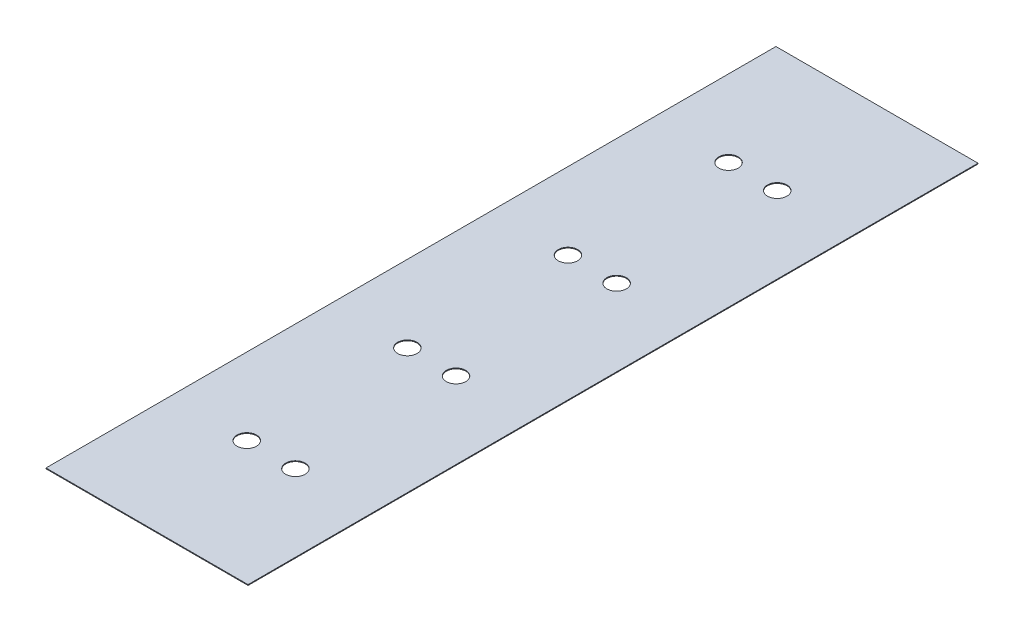
ISO-10303-21;
HEADER;
FILE_DESCRIPTION(('STEP AP214'),'2;1');
FILE_NAME('part.step','',(''),(''),'','','');
FILE_SCHEMA(('AUTOMOTIVE_DESIGN { 1 0 10303 214 1 1 1 1 }'));
ENDSEC;
DATA;
#1=APPLICATION_CONTEXT('core data for automotive mechanical design processes');
#2=APPLICATION_PROTOCOL_DEFINITION('international standard','automotive_design',2000,#1);
#3=PRODUCT_CONTEXT('',#1,'mechanical');
#4=PRODUCT('Part','Part','',(#3));
#5=PRODUCT_RELATED_PRODUCT_CATEGORY('part','',(#4));
#6=PRODUCT_DEFINITION_FORMATION('','',#4);
#7=PRODUCT_DEFINITION_CONTEXT('part definition',#1,'design');
#8=PRODUCT_DEFINITION('design','',#6,#7);
#9=PRODUCT_DEFINITION_SHAPE('','',#8);
#10=(LENGTH_UNIT() NAMED_UNIT(*) SI_UNIT(.MILLI.,.METRE.));
#11=(NAMED_UNIT(*) PLANE_ANGLE_UNIT() SI_UNIT($,.RADIAN.));
#12=(NAMED_UNIT(*) SI_UNIT($,.STERADIAN.) SOLID_ANGLE_UNIT());
#13=UNCERTAINTY_MEASURE_WITH_UNIT(LENGTH_MEASURE(1.E-05),#10,'distance_accuracy_value','');
#14=(GEOMETRIC_REPRESENTATION_CONTEXT(3) GLOBAL_UNCERTAINTY_ASSIGNED_CONTEXT((#13)) GLOBAL_UNIT_ASSIGNED_CONTEXT((#10,
#11,#12)) REPRESENTATION_CONTEXT('',''));
#15=CARTESIAN_POINT('',(0.,0.,0.));
#16=DIRECTION('',(0.,0.,1.));
#17=DIRECTION('',(1.,0.,0.));
#18=AXIS2_PLACEMENT_3D('',#15,#16,#17);
#19=CARTESIAN_POINT('',(0.8,10.,750.));
#20=DIRECTION('',(0.,0.,1.));
#21=DIRECTION('',(1.,0.,0.));
#22=AXIS2_PLACEMENT_3D('',#19,#20,#21);
#23=PLANE('',#22);
#24=DIRECTION('',(1.,0.,0.));
#25=VECTOR('',#24,1.);
#26=CARTESIAN_POINT('',(4.,14.,750.));
#27=LINE('',#26,#25);
#28=CARTESIAN_POINT('',(-21.3097335529232,14.0000000000001,750.));
#29=VERTEX_POINT('',#28);
#30=CARTESIAN_POINT('',(186.309733552923,14.0000000000001,750.));
#31=VERTEX_POINT('',#30);
#32=EDGE_CURVE('E57',#29,#31,#27,.T.);
#33=ORIENTED_EDGE('',*,*,#32,.F.);
#34=DIRECTION('',(0.,1.,0.));
#35=VECTOR('',#34,1.);
#36=CARTESIAN_POINT('',(-21.3097335529233,13.2000000000001,750.));
#37=LINE('',#36,#35);
#38=CARTESIAN_POINT('',(-21.3097335529233,13.2000000000001,750.));
#39=VERTEX_POINT('',#38);
#40=EDGE_CURVE('E116',#39,#29,#37,.T.);
#41=ORIENTED_EDGE('',*,*,#40,.F.);
#42=DIRECTION('',(1.,0.,0.));
#43=VECTOR('',#42,1.);
#44=CARTESIAN_POINT('',(4.,13.2,750.));
#45=LINE('',#44,#43);
#46=CARTESIAN_POINT('',(186.309733552923,13.2000000000001,750.));
#47=VERTEX_POINT('',#46);
#48=EDGE_CURVE('E12',#39,#47,#45,.T.);
#49=ORIENTED_EDGE('',*,*,#48,.T.);
#50=DIRECTION('',(0.,-1.,0.));
#51=VECTOR('',#50,1.);
#52=CARTESIAN_POINT('',(186.309733552923,14.0000000000001,750.));
#53=LINE('',#52,#51);
#54=EDGE_CURVE('E101',#31,#47,#53,.T.);
#55=ORIENTED_EDGE('',*,*,#54,.F.);
#56=EDGE_LOOP('',(#33,#41,#49,#55));
#57=FACE_BOUND('',#56,.T.);
#58=ADVANCED_FACE('F47',(#57),#23,.T.);
#59=CARTESIAN_POINT('',(164.2,10.,0.));
#60=DIRECTION('',(0.,0.,-1.));
#61=DIRECTION('',(-1.,0.,0.));
#62=AXIS2_PLACEMENT_3D('',#59,#60,#61);
#63=PLANE('',#62);
#64=DIRECTION('',(1.,0.,0.));
#65=VECTOR('',#64,1.);
#66=CARTESIAN_POINT('',(4.,14.,0.));
#67=LINE('',#66,#65);
#68=CARTESIAN_POINT('',(-21.3097335529232,14.0000000000001,0.));
#69=VERTEX_POINT('',#68);
#70=CARTESIAN_POINT('',(186.309733552923,14.0000000000001,0.));
#71=VERTEX_POINT('',#70);
#72=EDGE_CURVE('E77',#69,#71,#67,.T.);
#73=ORIENTED_EDGE('',*,*,#72,.T.);
#74=DIRECTION('',(0.,-1.,0.));
#75=VECTOR('',#74,1.);
#76=CARTESIAN_POINT('',(186.309733552923,14.0000000000001,0.));
#77=LINE('',#76,#75);
#78=CARTESIAN_POINT('',(186.309733552923,13.2000000000001,0.));
#79=VERTEX_POINT('',#78);
#80=EDGE_CURVE('E103',#71,#79,#77,.T.);
#81=ORIENTED_EDGE('',*,*,#80,.T.);
#82=DIRECTION('',(1.,0.,0.));
#83=VECTOR('',#82,1.);
#84=CARTESIAN_POINT('',(4.,13.2,0.));
#85=LINE('',#84,#83);
#86=CARTESIAN_POINT('',(-21.3097335529233,13.2000000000001,0.));
#87=VERTEX_POINT('',#86);
#88=EDGE_CURVE('E90',#87,#79,#85,.T.);
#89=ORIENTED_EDGE('',*,*,#88,.F.);
#90=DIRECTION('',(0.,1.,0.));
#91=VECTOR('',#90,1.);
#92=CARTESIAN_POINT('',(-21.3097335529233,13.2000000000001,0.));
#93=LINE('',#92,#91);
#94=EDGE_CURVE('E109',#87,#69,#93,.T.);
#95=ORIENTED_EDGE('',*,*,#94,.T.);
#96=EDGE_LOOP('',(#73,#81,#89,#95));
#97=FACE_BOUND('',#96,.T.);
#98=ADVANCED_FACE('F185',(#97),#63,.T.);
#99=CARTESIAN_POINT('',(4.,14.,750.));
#100=DIRECTION('',(0.,1.,0.));
#101=DIRECTION('',(-1.,0.,0.));
#102=AXIS2_PLACEMENT_3D('',#99,#100,#101);
#103=PLANE('',#102);
#104=CARTESIAN_POINT('',(107.5,14.,292.5));
#105=DIRECTION('',(0.,1.,0.));
#106=DIRECTION('',(0.,0.,1.));
#107=AXIS2_PLACEMENT_3D('',#104,#105,#106);
#108=CIRCLE('',#107,10.);
#109=CARTESIAN_POINT('',(107.5,14.,302.5));
#110=VERTEX_POINT('',#109);
#111=EDGE_CURVE('E118',#110,#110,#108,.T.);
#112=ORIENTED_EDGE('',*,*,#111,.F.);
#113=EDGE_LOOP('',(#112));
#114=FACE_BOUND('',#113,.T.);
#115=CARTESIAN_POINT('',(107.5,14.,457.5));
#116=DIRECTION('',(0.,1.,0.));
#117=DIRECTION('',(0.,0.,1.));
#118=AXIS2_PLACEMENT_3D('',#115,#116,#117);
#119=CIRCLE('',#118,10.);
#120=CARTESIAN_POINT('',(107.5,14.,467.5));
#121=VERTEX_POINT('',#120);
#122=EDGE_CURVE('E122',#121,#121,#119,.T.);
#123=ORIENTED_EDGE('',*,*,#122,.F.);
#124=EDGE_LOOP('',(#123));
#125=FACE_BOUND('',#124,.T.);
#126=CARTESIAN_POINT('',(107.5,14.,622.5));
#127=DIRECTION('',(0.,1.,0.));
#128=DIRECTION('',(0.,0.,1.));
#129=AXIS2_PLACEMENT_3D('',#126,#127,#128);
#130=CIRCLE('',#129,10.);
#131=CARTESIAN_POINT('',(107.5,14.,632.5));
#132=VERTEX_POINT('',#131);
#133=EDGE_CURVE('E125',#132,#132,#130,.T.);
#134=ORIENTED_EDGE('',*,*,#133,.F.);
#135=EDGE_LOOP('',(#134));
#136=FACE_BOUND('',#135,.T.);
#137=CARTESIAN_POINT('',(57.5,14.,622.5));
#138=DIRECTION('',(0.,1.,0.));
#139=DIRECTION('',(0.,0.,1.));
#140=AXIS2_PLACEMENT_3D('',#137,#138,#139);
#141=CIRCLE('',#140,10.);
#142=CARTESIAN_POINT('',(57.5,14.,632.5));
#143=VERTEX_POINT('',#142);
#144=EDGE_CURVE('E128',#143,#143,#141,.T.);
#145=ORIENTED_EDGE('',*,*,#144,.F.);
#146=EDGE_LOOP('',(#145));
#147=FACE_BOUND('',#146,.T.);
#148=CARTESIAN_POINT('',(57.5,14.,457.5));
#149=DIRECTION('',(0.,1.,0.));
#150=DIRECTION('',(0.,0.,1.));
#151=AXIS2_PLACEMENT_3D('',#148,#149,#150);
#152=CIRCLE('',#151,10.);
#153=CARTESIAN_POINT('',(57.5,14.,467.5));
#154=VERTEX_POINT('',#153);
#155=EDGE_CURVE('E131',#154,#154,#152,.T.);
#156=ORIENTED_EDGE('',*,*,#155,.F.);
#157=EDGE_LOOP('',(#156));
#158=FACE_BOUND('',#157,.T.);
#159=CARTESIAN_POINT('',(57.4999999999999,14.,292.5));
#160=DIRECTION('',(0.,1.,0.));
#161=DIRECTION('',(0.,0.,1.));
#162=AXIS2_PLACEMENT_3D('',#159,#160,#161);
#163=CIRCLE('',#162,10.);
#164=CARTESIAN_POINT('',(57.4999999999999,14.,302.5));
#165=VERTEX_POINT('',#164);
#166=EDGE_CURVE('E134',#165,#165,#163,.T.);
#167=ORIENTED_EDGE('',*,*,#166,.F.);
#168=EDGE_LOOP('',(#167));
#169=FACE_BOUND('',#168,.T.);
#170=CARTESIAN_POINT('',(57.5,14.,127.5));
#171=DIRECTION('',(0.,1.,0.));
#172=DIRECTION('',(0.,0.,1.));
#173=AXIS2_PLACEMENT_3D('',#170,#171,#172);
#174=CIRCLE('',#173,10.);
#175=CARTESIAN_POINT('',(57.5,14.,137.5));
#176=VERTEX_POINT('',#175);
#177=EDGE_CURVE('E112',#176,#176,#174,.T.);
#178=ORIENTED_EDGE('',*,*,#177,.F.);
#179=EDGE_LOOP('',(#178));
#180=FACE_BOUND('',#179,.T.);
#181=CARTESIAN_POINT('',(107.5,14.,127.5));
#182=DIRECTION('',(0.,1.,0.));
#183=DIRECTION('',(0.,0.,1.));
#184=AXIS2_PLACEMENT_3D('',#181,#182,#183);
#185=CIRCLE('',#184,9.99999999999999);
#186=CARTESIAN_POINT('',(107.5,14.,137.5));
#187=VERTEX_POINT('',#186);
#188=EDGE_CURVE('E139',#187,#187,#185,.T.);
#189=ORIENTED_EDGE('',*,*,#188,.F.);
#190=EDGE_LOOP('',(#189));
#191=FACE_BOUND('',#190,.T.);
#192=ORIENTED_EDGE('',*,*,#72,.F.);
#193=DIRECTION('',(0.,0.,-1.));
#194=VECTOR('',#193,1.);
#195=CARTESIAN_POINT('',(-21.3097335529232,14.0000000000001,750.));
#196=LINE('',#195,#194);
#197=EDGE_CURVE('E95',#29,#69,#196,.T.);
#198=ORIENTED_EDGE('',*,*,#197,.F.);
#199=ORIENTED_EDGE('',*,*,#32,.T.);
#200=DIRECTION('',(0.,0.,-1.));
#201=VECTOR('',#200,1.);
#202=CARTESIAN_POINT('',(186.309733552923,14.0000000000001,750.));
#203=LINE('',#202,#201);
#204=EDGE_CURVE('E93',#31,#71,#203,.T.);
#205=ORIENTED_EDGE('',*,*,#204,.T.);
#206=EDGE_LOOP('',(#192,#198,#199,#205));
#207=FACE_BOUND('',#206,.T.);
#208=ADVANCED_FACE('F49',(#114,#125,#136,#147,#158,#169,#180,#191,#207),#103,.T.);
#209=CARTESIAN_POINT('',(4.,13.2,750.));
#210=DIRECTION('',(0.,1.,0.));
#211=DIRECTION('',(-1.,0.,0.));
#212=AXIS2_PLACEMENT_3D('',#209,#210,#211);
#213=PLANE('',#212);
#214=CARTESIAN_POINT('',(107.5,13.2,292.5));
#215=DIRECTION('',(0.,1.,0.));
#216=DIRECTION('',(-1.,0.,0.));
#217=AXIS2_PLACEMENT_3D('',#214,#215,#216);
#218=CIRCLE('',#217,10.);
#219=CARTESIAN_POINT('',(97.5,13.2,292.5));
#220=VERTEX_POINT('',#219);
#221=EDGE_CURVE('E51',#220,#220,#218,.T.);
#222=ORIENTED_EDGE('',*,*,#221,.T.);
#223=EDGE_LOOP('',(#222));
#224=FACE_BOUND('',#223,.T.);
#225=CARTESIAN_POINT('',(107.5,13.2,457.5));
#226=DIRECTION('',(0.,1.,0.));
#227=DIRECTION('',(-1.,0.,0.));
#228=AXIS2_PLACEMENT_3D('',#225,#226,#227);
#229=CIRCLE('',#228,10.);
#230=CARTESIAN_POINT('',(97.5,13.2,457.5));
#231=VERTEX_POINT('',#230);
#232=EDGE_CURVE('E160',#231,#231,#229,.T.);
#233=ORIENTED_EDGE('',*,*,#232,.T.);
#234=EDGE_LOOP('',(#233));
#235=FACE_BOUND('',#234,.T.);
#236=CARTESIAN_POINT('',(107.5,13.2,622.5));
#237=DIRECTION('',(0.,1.,0.));
#238=DIRECTION('',(-1.,0.,0.));
#239=AXIS2_PLACEMENT_3D('',#236,#237,#238);
#240=CIRCLE('',#239,10.);
#241=CARTESIAN_POINT('',(97.5,13.2,622.5));
#242=VERTEX_POINT('',#241);
#243=EDGE_CURVE('E158',#242,#242,#240,.T.);
#244=ORIENTED_EDGE('',*,*,#243,.T.);
#245=EDGE_LOOP('',(#244));
#246=FACE_BOUND('',#245,.T.);
#247=CARTESIAN_POINT('',(57.5,13.2,622.5));
#248=DIRECTION('',(0.,1.,0.));
#249=DIRECTION('',(-1.,0.,0.));
#250=AXIS2_PLACEMENT_3D('',#247,#248,#249);
#251=CIRCLE('',#250,10.);
#252=CARTESIAN_POINT('',(47.5,13.2,622.5));
#253=VERTEX_POINT('',#252);
#254=EDGE_CURVE('E155',#253,#253,#251,.T.);
#255=ORIENTED_EDGE('',*,*,#254,.T.);
#256=EDGE_LOOP('',(#255));
#257=FACE_BOUND('',#256,.T.);
#258=CARTESIAN_POINT('',(57.5,13.2,457.5));
#259=DIRECTION('',(0.,1.,0.));
#260=DIRECTION('',(-1.,0.,0.));
#261=AXIS2_PLACEMENT_3D('',#258,#259,#260);
#262=CIRCLE('',#261,10.);
#263=CARTESIAN_POINT('',(47.5,13.2,457.5));
#264=VERTEX_POINT('',#263);
#265=EDGE_CURVE('E152',#264,#264,#262,.T.);
#266=ORIENTED_EDGE('',*,*,#265,.T.);
#267=EDGE_LOOP('',(#266));
#268=FACE_BOUND('',#267,.T.);
#269=CARTESIAN_POINT('',(57.4999999999999,13.2,292.5));
#270=DIRECTION('',(0.,1.,0.));
#271=DIRECTION('',(-1.,0.,0.));
#272=AXIS2_PLACEMENT_3D('',#269,#270,#271);
#273=CIRCLE('',#272,10.);
#274=CARTESIAN_POINT('',(47.4999999999999,13.2,292.5));
#275=VERTEX_POINT('',#274);
#276=EDGE_CURVE('E149',#275,#275,#273,.T.);
#277=ORIENTED_EDGE('',*,*,#276,.T.);
#278=EDGE_LOOP('',(#277));
#279=FACE_BOUND('',#278,.T.);
#280=CARTESIAN_POINT('',(57.5,13.2,127.5));
#281=DIRECTION('',(0.,1.,0.));
#282=DIRECTION('',(-1.,0.,0.));
#283=AXIS2_PLACEMENT_3D('',#280,#281,#282);
#284=CIRCLE('',#283,10.);
#285=CARTESIAN_POINT('',(47.5,13.2,127.5));
#286=VERTEX_POINT('',#285);
#287=EDGE_CURVE('E121',#286,#286,#284,.T.);
#288=ORIENTED_EDGE('',*,*,#287,.T.);
#289=EDGE_LOOP('',(#288));
#290=FACE_BOUND('',#289,.T.);
#291=CARTESIAN_POINT('',(107.5,13.2,127.5));
#292=DIRECTION('',(0.,1.,0.));
#293=DIRECTION('',(-1.,0.,0.));
#294=AXIS2_PLACEMENT_3D('',#291,#292,#293);
#295=CIRCLE('',#294,9.99999999999999);
#296=CARTESIAN_POINT('',(97.5,13.2,127.5));
#297=VERTEX_POINT('',#296);
#298=EDGE_CURVE('E141',#297,#297,#295,.T.);
#299=ORIENTED_EDGE('',*,*,#298,.T.);
#300=EDGE_LOOP('',(#299));
#301=FACE_BOUND('',#300,.T.);
#302=ORIENTED_EDGE('',*,*,#88,.T.);
#303=DIRECTION('',(0.,0.,-1.));
#304=VECTOR('',#303,1.);
#305=CARTESIAN_POINT('',(186.309733552923,13.2000000000001,750.));
#306=LINE('',#305,#304);
#307=EDGE_CURVE('E104',#47,#79,#306,.T.);
#308=ORIENTED_EDGE('',*,*,#307,.F.);
#309=ORIENTED_EDGE('',*,*,#48,.F.);
#310=DIRECTION('',(0.,0.,-1.));
#311=VECTOR('',#310,1.);
#312=CARTESIAN_POINT('',(-21.3097335529233,13.2000000000001,750.));
#313=LINE('',#312,#311);
#314=EDGE_CURVE('E113',#39,#87,#313,.T.);
#315=ORIENTED_EDGE('',*,*,#314,.T.);
#316=EDGE_LOOP('',(#302,#308,#309,#315));
#317=FACE_BOUND('',#316,.T.);
#318=ADVANCED_FACE('F167',(#224,#235,#246,#257,#268,#279,#290,#301,#317),#213,.F.);
#319=CARTESIAN_POINT('',(107.5,4.,127.5));
#320=DIRECTION('',(0.,1.,0.));
#321=DIRECTION('',(0.,0.,1.));
#322=AXIS2_PLACEMENT_3D('',#319,#320,#321);
#323=CYLINDRICAL_SURFACE('',#322,9.99999999999999);
#324=ORIENTED_EDGE('',*,*,#188,.T.);
#325=EDGE_LOOP('',(#324));
#326=FACE_BOUND('',#325,.T.);
#327=ORIENTED_EDGE('',*,*,#298,.F.);
#328=EDGE_LOOP('',(#327));
#329=FACE_BOUND('',#328,.T.);
#330=ADVANCED_FACE('F195',(#326,#329),#323,.F.);
#331=CARTESIAN_POINT('',(57.5,4.,127.5));
#332=DIRECTION('',(0.,1.,0.));
#333=DIRECTION('',(0.,0.,1.));
#334=AXIS2_PLACEMENT_3D('',#331,#332,#333);
#335=CYLINDRICAL_SURFACE('',#334,10.);
#336=ORIENTED_EDGE('',*,*,#177,.T.);
#337=EDGE_LOOP('',(#336));
#338=FACE_BOUND('',#337,.T.);
#339=ORIENTED_EDGE('',*,*,#287,.F.);
#340=EDGE_LOOP('',(#339));
#341=FACE_BOUND('',#340,.T.);
#342=ADVANCED_FACE('F198',(#338,#341),#335,.F.);
#343=CARTESIAN_POINT('',(57.4999999999999,4.,292.5));
#344=DIRECTION('',(0.,1.,0.));
#345=DIRECTION('',(0.,0.,1.));
#346=AXIS2_PLACEMENT_3D('',#343,#344,#345);
#347=CYLINDRICAL_SURFACE('',#346,10.);
#348=ORIENTED_EDGE('',*,*,#166,.T.);
#349=EDGE_LOOP('',(#348));
#350=FACE_BOUND('',#349,.T.);
#351=ORIENTED_EDGE('',*,*,#276,.F.);
#352=EDGE_LOOP('',(#351));
#353=FACE_BOUND('',#352,.T.);
#354=ADVANCED_FACE('F202',(#350,#353),#347,.F.);
#355=CARTESIAN_POINT('',(57.5,4.,457.5));
#356=DIRECTION('',(0.,1.,0.));
#357=DIRECTION('',(0.,0.,1.));
#358=AXIS2_PLACEMENT_3D('',#355,#356,#357);
#359=CYLINDRICAL_SURFACE('',#358,10.);
#360=ORIENTED_EDGE('',*,*,#155,.T.);
#361=EDGE_LOOP('',(#360));
#362=FACE_BOUND('',#361,.T.);
#363=ORIENTED_EDGE('',*,*,#265,.F.);
#364=EDGE_LOOP('',(#363));
#365=FACE_BOUND('',#364,.T.);
#366=ADVANCED_FACE('F206',(#362,#365),#359,.F.);
#367=CARTESIAN_POINT('',(57.5,4.,622.5));
#368=DIRECTION('',(0.,1.,0.));
#369=DIRECTION('',(0.,0.,1.));
#370=AXIS2_PLACEMENT_3D('',#367,#368,#369);
#371=CYLINDRICAL_SURFACE('',#370,10.);
#372=ORIENTED_EDGE('',*,*,#144,.T.);
#373=EDGE_LOOP('',(#372));
#374=FACE_BOUND('',#373,.T.);
#375=ORIENTED_EDGE('',*,*,#254,.F.);
#376=EDGE_LOOP('',(#375));
#377=FACE_BOUND('',#376,.T.);
#378=ADVANCED_FACE('F210',(#374,#377),#371,.F.);
#379=CARTESIAN_POINT('',(107.5,4.,622.5));
#380=DIRECTION('',(0.,1.,0.));
#381=DIRECTION('',(0.,0.,1.));
#382=AXIS2_PLACEMENT_3D('',#379,#380,#381);
#383=CYLINDRICAL_SURFACE('',#382,10.);
#384=ORIENTED_EDGE('',*,*,#133,.T.);
#385=EDGE_LOOP('',(#384));
#386=FACE_BOUND('',#385,.T.);
#387=ORIENTED_EDGE('',*,*,#243,.F.);
#388=EDGE_LOOP('',(#387));
#389=FACE_BOUND('',#388,.T.);
#390=ADVANCED_FACE('F181',(#386,#389),#383,.F.);
#391=CARTESIAN_POINT('',(107.5,4.,457.5));
#392=DIRECTION('',(0.,1.,0.));
#393=DIRECTION('',(0.,0.,1.));
#394=AXIS2_PLACEMENT_3D('',#391,#392,#393);
#395=CYLINDRICAL_SURFACE('',#394,10.);
#396=ORIENTED_EDGE('',*,*,#122,.T.);
#397=EDGE_LOOP('',(#396));
#398=FACE_BOUND('',#397,.T.);
#399=ORIENTED_EDGE('',*,*,#232,.F.);
#400=EDGE_LOOP('',(#399));
#401=FACE_BOUND('',#400,.T.);
#402=ADVANCED_FACE('F172',(#398,#401),#395,.F.);
#403=CARTESIAN_POINT('',(107.5,4.,292.5));
#404=DIRECTION('',(0.,1.,0.));
#405=DIRECTION('',(0.,0.,1.));
#406=AXIS2_PLACEMENT_3D('',#403,#404,#405);
#407=CYLINDRICAL_SURFACE('',#406,10.);
#408=ORIENTED_EDGE('',*,*,#111,.T.);
#409=EDGE_LOOP('',(#408));
#410=FACE_BOUND('',#409,.T.);
#411=ORIENTED_EDGE('',*,*,#221,.F.);
#412=EDGE_LOOP('',(#411));
#413=FACE_BOUND('',#412,.T.);
#414=ADVANCED_FACE('F169',(#410,#413),#407,.F.);
#415=CARTESIAN_POINT('',(-21.3097335529233,13.2000000000001,750.));
#416=DIRECTION('',(-1.,0.,0.));
#417=DIRECTION('',(0.,0.,-1.));
#418=AXIS2_PLACEMENT_3D('',#415,#416,#417);
#419=PLANE('',#418);
#420=ORIENTED_EDGE('',*,*,#94,.F.);
#421=ORIENTED_EDGE('',*,*,#314,.F.);
#422=ORIENTED_EDGE('',*,*,#40,.T.);
#423=ORIENTED_EDGE('',*,*,#197,.T.);
#424=EDGE_LOOP('',(#420,#421,#422,#423));
#425=FACE_BOUND('',#424,.T.);
#426=ADVANCED_FACE('F171',(#425),#419,.T.);
#427=CARTESIAN_POINT('',(186.309733552923,14.0000000000001,750.));
#428=DIRECTION('',(1.,0.,0.));
#429=DIRECTION('',(0.,0.,1.));
#430=AXIS2_PLACEMENT_3D('',#427,#428,#429);
#431=PLANE('',#430);
#432=ORIENTED_EDGE('',*,*,#80,.F.);
#433=ORIENTED_EDGE('',*,*,#204,.F.);
#434=ORIENTED_EDGE('',*,*,#54,.T.);
#435=ORIENTED_EDGE('',*,*,#307,.T.);
#436=EDGE_LOOP('',(#432,#433,#434,#435));
#437=FACE_BOUND('',#436,.T.);
#438=ADVANCED_FACE('F100',(#437),#431,.T.);
#439=CLOSED_SHELL('',(#58,#98,#208,#318,#330,#342,#354,#366,#378,#390,#402,#414,#426,#438));
#440=MANIFOLD_SOLID_BREP('B2',#439);
#441=ADVANCED_BREP_SHAPE_REPRESENTATION('',(#18,#440),#14);
#442=SHAPE_DEFINITION_REPRESENTATION(#9,#441);
ENDSEC;
END-ISO-10303-21;
